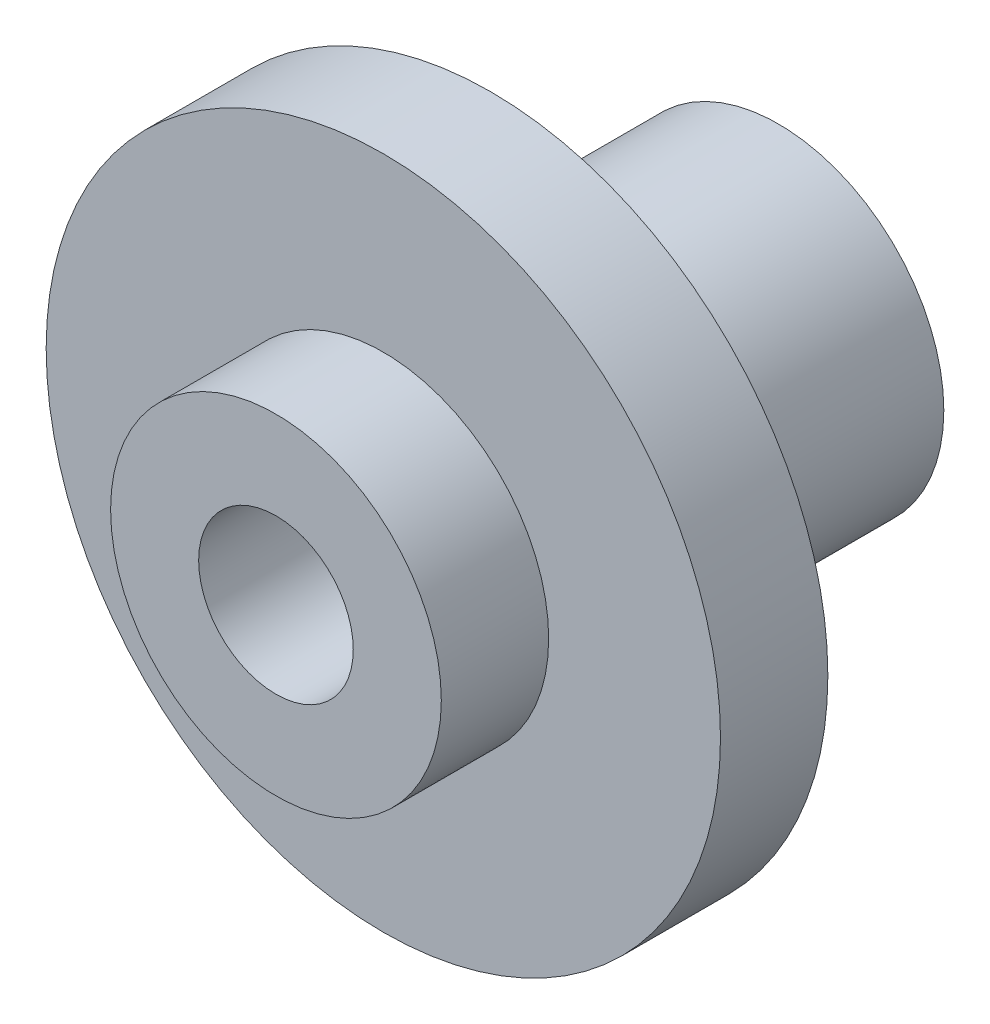
ISO-10303-21;
HEADER;
FILE_DESCRIPTION(('STEP AP214'),'2;1');
FILE_NAME('part.step','',(''),(''),'','','');
FILE_SCHEMA(('AUTOMOTIVE_DESIGN { 1 0 10303 214 1 1 1 1 }'));
ENDSEC;
DATA;
#1=APPLICATION_CONTEXT('core data for automotive mechanical design processes');
#2=APPLICATION_PROTOCOL_DEFINITION('international standard','automotive_design',2000,#1);
#3=PRODUCT_CONTEXT('',#1,'mechanical');
#4=PRODUCT('Part','Part','',(#3));
#5=PRODUCT_RELATED_PRODUCT_CATEGORY('part','',(#4));
#6=PRODUCT_DEFINITION_FORMATION('','',#4);
#7=PRODUCT_DEFINITION_CONTEXT('part definition',#1,'design');
#8=PRODUCT_DEFINITION('design','',#6,#7);
#9=PRODUCT_DEFINITION_SHAPE('','',#8);
#10=(LENGTH_UNIT() NAMED_UNIT(*) SI_UNIT(.MILLI.,.METRE.));
#11=(NAMED_UNIT(*) PLANE_ANGLE_UNIT() SI_UNIT($,.RADIAN.));
#12=(NAMED_UNIT(*) SI_UNIT($,.STERADIAN.) SOLID_ANGLE_UNIT());
#13=UNCERTAINTY_MEASURE_WITH_UNIT(LENGTH_MEASURE(1.E-05),#10,'distance_accuracy_value','');
#14=(GEOMETRIC_REPRESENTATION_CONTEXT(3) GLOBAL_UNCERTAINTY_ASSIGNED_CONTEXT((#13)) GLOBAL_UNIT_ASSIGNED_CONTEXT((#10,
#11,#12)) REPRESENTATION_CONTEXT('',''));
#15=CARTESIAN_POINT('',(0.,0.,0.));
#16=DIRECTION('',(0.,0.,1.));
#17=DIRECTION('',(1.,0.,0.));
#18=AXIS2_PLACEMENT_3D('',#15,#16,#17);
#19=CARTESIAN_POINT('',(0.,0.,1.27));
#20=DIRECTION('',(0.,0.,-1.));
#21=DIRECTION('',(-1.,0.,0.));
#22=AXIS2_PLACEMENT_3D('',#19,#20,#21);
#23=CYLINDRICAL_SURFACE('',#22,3.9878);
#24=CARTESIAN_POINT('',(0.,0.,1.27));
#25=DIRECTION('',(0.,0.,1.));
#26=DIRECTION('',(1.,0.,0.));
#27=AXIS2_PLACEMENT_3D('',#24,#25,#26);
#28=CIRCLE('',#27,3.9878);
#29=CARTESIAN_POINT('',(3.9878,0.,1.27));
#30=VERTEX_POINT('',#29);
#31=EDGE_CURVE('E43',#30,#30,#28,.T.);
#32=ORIENTED_EDGE('',*,*,#31,.F.);
#33=EDGE_LOOP('',(#32));
#34=FACE_BOUND('',#33,.T.);
#35=CARTESIAN_POINT('',(0.,0.,0.));
#36=DIRECTION('',(0.,0.,1.));
#37=DIRECTION('',(1.,0.,0.));
#38=AXIS2_PLACEMENT_3D('',#35,#36,#37);
#39=CIRCLE('',#38,3.9878);
#40=CARTESIAN_POINT('',(3.9878,0.,0.));
#41=VERTEX_POINT('',#40);
#42=EDGE_CURVE('E39',#41,#41,#39,.T.);
#43=ORIENTED_EDGE('',*,*,#42,.T.);
#44=EDGE_LOOP('',(#43));
#45=FACE_BOUND('',#44,.T.);
#46=ADVANCED_FACE('F36',(#34,#45),#23,.T.);
#47=CARTESIAN_POINT('',(0.,0.,1.27));
#48=DIRECTION('',(0.,0.,1.));
#49=DIRECTION('',(1.,0.,0.));
#50=AXIS2_PLACEMENT_3D('',#47,#48,#49);
#51=PLANE('',#50);
#52=CARTESIAN_POINT('',(0.,0.,1.27));
#53=DIRECTION('',(0.,0.,1.));
#54=DIRECTION('',(1.,0.,0.));
#55=AXIS2_PLACEMENT_3D('',#52,#53,#54);
#56=CIRCLE('',#55,1.9558);
#57=CARTESIAN_POINT('',(1.9558,0.,1.27));
#58=VERTEX_POINT('',#57);
#59=EDGE_CURVE('E55',#58,#58,#56,.T.);
#60=ORIENTED_EDGE('',*,*,#59,.F.);
#61=EDGE_LOOP('',(#60));
#62=FACE_BOUND('',#61,.T.);
#63=ORIENTED_EDGE('',*,*,#31,.T.);
#64=EDGE_LOOP('',(#63));
#65=FACE_BOUND('',#64,.T.);
#66=ADVANCED_FACE('F64',(#62,#65),#51,.T.);
#67=CARTESIAN_POINT('',(0.,0.,0.));
#68=DIRECTION('',(0.,0.,1.));
#69=DIRECTION('',(1.,0.,0.));
#70=AXIS2_PLACEMENT_3D('',#67,#68,#69);
#71=PLANE('',#70);
#72=CARTESIAN_POINT('',(0.,0.,0.));
#73=DIRECTION('',(0.,0.,-1.));
#74=DIRECTION('',(-1.,0.,0.));
#75=AXIS2_PLACEMENT_3D('',#72,#73,#74);
#76=CIRCLE('',#75,1.9558);
#77=CARTESIAN_POINT('',(-1.9558,0.,0.));
#78=VERTEX_POINT('',#77);
#79=EDGE_CURVE('E10',#78,#78,#76,.T.);
#80=ORIENTED_EDGE('',*,*,#79,.F.);
#81=EDGE_LOOP('',(#80));
#82=FACE_BOUND('',#81,.T.);
#83=ORIENTED_EDGE('',*,*,#42,.F.);
#84=EDGE_LOOP('',(#83));
#85=FACE_BOUND('',#84,.T.);
#86=ADVANCED_FACE('F67',(#82,#85),#71,.F.);
#87=CARTESIAN_POINT('',(0.,0.,2.54));
#88=DIRECTION('',(0.,0.,1.));
#89=DIRECTION('',(1.,0.,0.));
#90=AXIS2_PLACEMENT_3D('',#87,#88,#89);
#91=PLANE('',#90);
#92=CARTESIAN_POINT('',(0.,0.,2.54));
#93=DIRECTION('',(0.,0.,1.));
#94=DIRECTION('',(1.,0.,0.));
#95=AXIS2_PLACEMENT_3D('',#92,#93,#94);
#96=CIRCLE('',#95,1.9558);
#97=CARTESIAN_POINT('',(1.9558,0.,2.54));
#98=VERTEX_POINT('',#97);
#99=EDGE_CURVE('E56',#98,#98,#96,.T.);
#100=ORIENTED_EDGE('',*,*,#99,.T.);
#101=EDGE_LOOP('',(#100));
#102=FACE_BOUND('',#101,.T.);
#103=CARTESIAN_POINT('',(0.,0.,2.54));
#104=DIRECTION('',(0.,0.,1.));
#105=DIRECTION('',(1.,0.,0.));
#106=AXIS2_PLACEMENT_3D('',#103,#104,#105);
#107=CIRCLE('',#106,0.914399999999999);
#108=CARTESIAN_POINT('',(0.914399999999999,0.,2.54));
#109=VERTEX_POINT('',#108);
#110=EDGE_CURVE('E52',#109,#109,#107,.T.);
#111=ORIENTED_EDGE('',*,*,#110,.F.);
#112=EDGE_LOOP('',(#111));
#113=FACE_BOUND('',#112,.T.);
#114=ADVANCED_FACE('F77',(#102,#113),#91,.T.);
#115=CARTESIAN_POINT('',(0.,0.,2.54));
#116=DIRECTION('',(0.,0.,-1.));
#117=DIRECTION('',(-1.,0.,0.));
#118=AXIS2_PLACEMENT_3D('',#115,#116,#117);
#119=CYLINDRICAL_SURFACE('',#118,1.9558);
#120=ORIENTED_EDGE('',*,*,#99,.F.);
#121=EDGE_LOOP('',(#120));
#122=FACE_BOUND('',#121,.T.);
#123=ORIENTED_EDGE('',*,*,#59,.T.);
#124=EDGE_LOOP('',(#123));
#125=FACE_BOUND('',#124,.T.);
#126=ADVANCED_FACE('F62',(#122,#125),#119,.T.);
#127=CARTESIAN_POINT('',(0.,0.,2.54));
#128=DIRECTION('',(0.,0.,-1.));
#129=DIRECTION('',(-1.,0.,0.));
#130=AXIS2_PLACEMENT_3D('',#127,#128,#129);
#131=CYLINDRICAL_SURFACE('',#130,0.914399999999999);
#132=ORIENTED_EDGE('',*,*,#110,.T.);
#133=EDGE_LOOP('',(#132));
#134=FACE_BOUND('',#133,.T.);
#135=CARTESIAN_POINT('',(0.,0.,-3.4036));
#136=DIRECTION('',(0.,0.,-1.));
#137=DIRECTION('',(-1.,0.,0.));
#138=AXIS2_PLACEMENT_3D('',#135,#136,#137);
#139=CIRCLE('',#138,0.9144);
#140=CARTESIAN_POINT('',(-0.9144,0.,-3.4036));
#141=VERTEX_POINT('',#140);
#142=EDGE_CURVE('E104',#141,#141,#139,.T.);
#143=ORIENTED_EDGE('',*,*,#142,.T.);
#144=EDGE_LOOP('',(#143));
#145=FACE_BOUND('',#144,.T.);
#146=ADVANCED_FACE('F86',(#134,#145),#131,.F.);
#147=CARTESIAN_POINT('',(0.,0.,-3.4036));
#148=DIRECTION('',(0.,0.,1.));
#149=DIRECTION('',(1.,0.,0.));
#150=AXIS2_PLACEMENT_3D('',#147,#148,#149);
#151=CYLINDRICAL_SURFACE('',#150,1.9558);
#152=CARTESIAN_POINT('',(0.,0.,-3.4036));
#153=DIRECTION('',(0.,0.,-1.));
#154=DIRECTION('',(-1.,0.,0.));
#155=AXIS2_PLACEMENT_3D('',#152,#153,#154);
#156=CIRCLE('',#155,1.9558);
#157=CARTESIAN_POINT('',(-1.9558,0.,-3.4036));
#158=VERTEX_POINT('',#157);
#159=EDGE_CURVE('E50',#158,#158,#156,.T.);
#160=ORIENTED_EDGE('',*,*,#159,.F.);
#161=EDGE_LOOP('',(#160));
#162=FACE_BOUND('',#161,.T.);
#163=ORIENTED_EDGE('',*,*,#79,.T.);
#164=EDGE_LOOP('',(#163));
#165=FACE_BOUND('',#164,.T.);
#166=ADVANCED_FACE('F91',(#162,#165),#151,.T.);
#167=CARTESIAN_POINT('',(0.,0.,-3.4036));
#168=DIRECTION('',(0.,0.,-1.));
#169=DIRECTION('',(-1.,0.,0.));
#170=AXIS2_PLACEMENT_3D('',#167,#168,#169);
#171=PLANE('',#170);
#172=ORIENTED_EDGE('',*,*,#142,.F.);
#173=EDGE_LOOP('',(#172));
#174=FACE_BOUND('',#173,.T.);
#175=ORIENTED_EDGE('',*,*,#159,.T.);
#176=EDGE_LOOP('',(#175));
#177=FACE_BOUND('',#176,.T.);
#178=ADVANCED_FACE('F95',(#174,#177),#171,.T.);
#179=CLOSED_SHELL('',(#46,#66,#86,#114,#126,#146,#166,#178));
#180=MANIFOLD_SOLID_BREP('B2',#179);
#181=ADVANCED_BREP_SHAPE_REPRESENTATION('',(#18,#180),#14);
#182=SHAPE_DEFINITION_REPRESENTATION(#9,#181);
ENDSEC;
END-ISO-10303-21;
